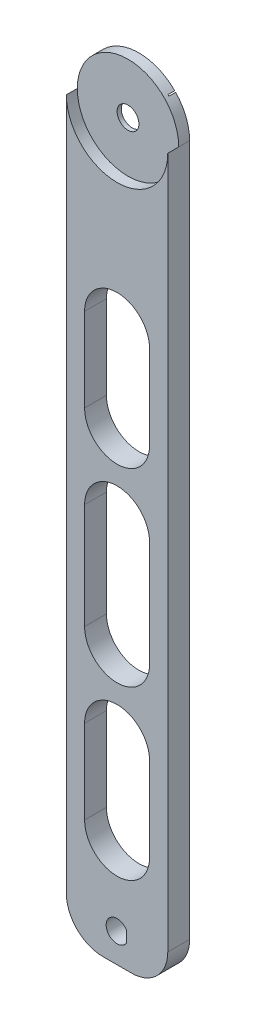
ISO-10303-21;
HEADER;
FILE_DESCRIPTION(('STEP AP214'),'2;1');
FILE_NAME('part.step','',(''),(''),'','','');
FILE_SCHEMA(('AUTOMOTIVE_DESIGN { 1 0 10303 214 1 1 1 1 }'));
ENDSEC;
DATA;
#1=APPLICATION_CONTEXT('core data for automotive mechanical design processes');
#2=APPLICATION_PROTOCOL_DEFINITION('international standard','automotive_design',2000,#1);
#3=PRODUCT_CONTEXT('',#1,'mechanical');
#4=PRODUCT('Part','Part','',(#3));
#5=PRODUCT_RELATED_PRODUCT_CATEGORY('part','',(#4));
#6=PRODUCT_DEFINITION_FORMATION('','',#4);
#7=PRODUCT_DEFINITION_CONTEXT('part definition',#1,'design');
#8=PRODUCT_DEFINITION('design','',#6,#7);
#9=PRODUCT_DEFINITION_SHAPE('','',#8);
#10=(LENGTH_UNIT() NAMED_UNIT(*) SI_UNIT(.MILLI.,.METRE.));
#11=(NAMED_UNIT(*) PLANE_ANGLE_UNIT() SI_UNIT($,.RADIAN.));
#12=(NAMED_UNIT(*) SI_UNIT($,.STERADIAN.) SOLID_ANGLE_UNIT());
#13=UNCERTAINTY_MEASURE_WITH_UNIT(LENGTH_MEASURE(1.E-05),#10,'distance_accuracy_value','');
#14=(GEOMETRIC_REPRESENTATION_CONTEXT(3) GLOBAL_UNCERTAINTY_ASSIGNED_CONTEXT((#13)) GLOBAL_UNIT_ASSIGNED_CONTEXT((#10,
#11,#12)) REPRESENTATION_CONTEXT('',''));
#15=CARTESIAN_POINT('',(0.,0.,0.));
#16=DIRECTION('',(0.,0.,1.));
#17=DIRECTION('',(1.,0.,0.));
#18=AXIS2_PLACEMENT_3D('',#15,#16,#17);
#19=CARTESIAN_POINT('',(0.,0.,0.));
#20=DIRECTION('',(0.,0.,1.));
#21=DIRECTION('',(1.,0.,0.));
#22=AXIS2_PLACEMENT_3D('',#19,#20,#21);
#23=PLANE('',#22);
#24=CARTESIAN_POINT('',(1.83507751937984,21.2113372093023,0.));
#25=DIRECTION('',(0.,0.,1.));
#26=DIRECTION('',(1.,0.,0.));
#27=AXIS2_PLACEMENT_3D('',#24,#25,#26);
#28=CIRCLE('',#27,13.925);
#29=CARTESIAN_POINT('',(11.6780001036533,31.0613372093023,0.));
#30=VERTEX_POINT('',#29);
#31=CARTESIAN_POINT('',(-8.00784506489359,31.0613372093023,0.));
#32=VERTEX_POINT('',#31);
#33=EDGE_CURVE('E361',#30,#32,#28,.T.);
#34=ORIENTED_EDGE('',*,*,#33,.F.);
#35=DIRECTION('',(1.,0.,0.));
#36=VECTOR('',#35,1.);
#37=CARTESIAN_POINT('',(11.9300775193798,31.0613372093023,0.));
#38=LINE('',#37,#36);
#39=EDGE_CURVE('E228',#32,#30,#38,.T.);
#40=ORIENTED_EDGE('',*,*,#39,.F.);
#41=EDGE_LOOP('',(#34,#40));
#42=FACE_BOUND('',#41,.T.);
#43=ADVANCED_FACE('F39',(#42),#23,.F.);
#44=CARTESIAN_POINT('',(1.83507751937984,21.2113372093023,0.));
#45=DIRECTION('',(0.,0.,1.));
#46=DIRECTION('',(1.,0.,0.));
#47=AXIS2_PLACEMENT_3D('',#44,#45,#46);
#48=CYLINDRICAL_SURFACE('',#47,3.);
#49=CARTESIAN_POINT('',(1.83507751937984,21.2113372093023,3.));
#50=DIRECTION('',(0.,0.,1.));
#51=DIRECTION('',(1.,0.,0.));
#52=AXIS2_PLACEMENT_3D('',#49,#50,#51);
#53=CIRCLE('',#52,3.);
#54=CARTESIAN_POINT('',(4.83507751937984,21.2113372093023,3.));
#55=VERTEX_POINT('',#54);
#56=EDGE_CURVE('E312',#55,#55,#53,.T.);
#57=ORIENTED_EDGE('',*,*,#56,.T.);
#58=EDGE_LOOP('',(#57));
#59=FACE_BOUND('',#58,.T.);
#60=CARTESIAN_POINT('',(1.83507751937984,21.2113372093023,1.85));
#61=DIRECTION('',(0.,0.,-1.));
#62=DIRECTION('',(-1.,0.,0.));
#63=AXIS2_PLACEMENT_3D('',#60,#61,#62);
#64=CIRCLE('',#63,3.);
#65=CARTESIAN_POINT('',(-1.16492248062016,21.2113372093023,1.85));
#66=VERTEX_POINT('',#65);
#67=EDGE_CURVE('E253',#66,#66,#64,.F.);
#68=ORIENTED_EDGE('',*,*,#67,.F.);
#69=EDGE_LOOP('',(#68));
#70=FACE_BOUND('',#69,.T.);
#71=ADVANCED_FACE('F510',(#59,#70),#48,.F.);
#72=CARTESIAN_POINT('',(5.76007751937987,-168.788662790698,6.));
#73=DIRECTION('',(0.,0.,1.));
#74=DIRECTION('',(1.,0.,0.));
#75=AXIS2_PLACEMENT_3D('',#72,#73,#74);
#76=CYLINDRICAL_SURFACE('',#75,10.);
#77=DIRECTION('',(0.,0.,-1.));
#78=VECTOR('',#77,1.);
#79=CARTESIAN_POINT('',(15.7600775193799,-168.788662790698,6.));
#80=LINE('',#79,#78);
#81=CARTESIAN_POINT('',(15.7600775193799,-168.788662790698,6.));
#82=VERTEX_POINT('',#81);
#83=CARTESIAN_POINT('',(15.7600775193799,-168.788662790698,0.));
#84=VERTEX_POINT('',#83);
#85=EDGE_CURVE('E414',#82,#84,#80,.T.);
#86=ORIENTED_EDGE('',*,*,#85,.F.);
#87=CARTESIAN_POINT('',(5.76007751937987,-168.788662790698,6.));
#88=DIRECTION('',(0.,0.,1.));
#89=DIRECTION('',(1.,0.,0.));
#90=AXIS2_PLACEMENT_3D('',#87,#88,#89);
#91=CIRCLE('',#90,10.);
#92=CARTESIAN_POINT('',(5.76007751937987,-178.788662790698,6.));
#93=VERTEX_POINT('',#92);
#94=EDGE_CURVE('E420',#93,#82,#91,.T.);
#95=ORIENTED_EDGE('',*,*,#94,.F.);
#96=DIRECTION('',(0.,0.,-1.));
#97=VECTOR('',#96,1.);
#98=CARTESIAN_POINT('',(5.76007751937987,-178.788662790698,6.));
#99=LINE('',#98,#97);
#100=CARTESIAN_POINT('',(5.76007751937987,-178.788662790698,0.));
#101=VERTEX_POINT('',#100);
#102=EDGE_CURVE('E417',#101,#93,#99,.F.);
#103=ORIENTED_EDGE('',*,*,#102,.F.);
#104=CARTESIAN_POINT('',(5.76007751937987,-168.788662790698,0.));
#105=DIRECTION('',(0.,0.,1.));
#106=DIRECTION('',(1.,0.,0.));
#107=AXIS2_PLACEMENT_3D('',#104,#105,#106);
#108=CIRCLE('',#107,10.);
#109=EDGE_CURVE('E62',#84,#101,#108,.F.);
#110=ORIENTED_EDGE('',*,*,#109,.F.);
#111=EDGE_LOOP('',(#86,#95,#103,#110));
#112=FACE_BOUND('',#111,.T.);
#113=ADVANCED_FACE('F41',(#112),#76,.T.);
#114=CARTESIAN_POINT('',(-2.08992248062013,-168.788662790698,6.));
#115=DIRECTION('',(0.,0.,1.));
#116=DIRECTION('',(1.,0.,0.));
#117=AXIS2_PLACEMENT_3D('',#114,#115,#116);
#118=CYLINDRICAL_SURFACE('',#117,10.);
#119=DIRECTION('',(0.,0.,1.));
#120=VECTOR('',#119,1.);
#121=CARTESIAN_POINT('',(-12.0899224806201,-168.788662790698,6.));
#122=LINE('',#121,#120);
#123=CARTESIAN_POINT('',(-12.0899224806201,-168.788662790698,0.));
#124=VERTEX_POINT('',#123);
#125=CARTESIAN_POINT('',(-12.0899224806201,-168.788662790698,6.));
#126=VERTEX_POINT('',#125);
#127=EDGE_CURVE('E404',#124,#126,#122,.T.);
#128=ORIENTED_EDGE('',*,*,#127,.F.);
#129=CARTESIAN_POINT('',(-2.08992248062013,-168.788662790698,0.));
#130=DIRECTION('',(0.,0.,1.));
#131=DIRECTION('',(1.,0.,0.));
#132=AXIS2_PLACEMENT_3D('',#129,#130,#131);
#133=CIRCLE('',#132,10.);
#134=CARTESIAN_POINT('',(-2.08992248062013,-178.788662790698,0.));
#135=VERTEX_POINT('',#134);
#136=EDGE_CURVE('E410',#135,#124,#133,.F.);
#137=ORIENTED_EDGE('',*,*,#136,.F.);
#138=DIRECTION('',(0.,0.,1.));
#139=VECTOR('',#138,1.);
#140=CARTESIAN_POINT('',(-2.08992248062013,-178.788662790698,6.));
#141=LINE('',#140,#139);
#142=CARTESIAN_POINT('',(-2.08992248062013,-178.788662790698,6.));
#143=VERTEX_POINT('',#142);
#144=EDGE_CURVE('E407',#143,#135,#141,.F.);
#145=ORIENTED_EDGE('',*,*,#144,.F.);
#146=CARTESIAN_POINT('',(-2.08992248062013,-168.788662790698,6.));
#147=DIRECTION('',(0.,0.,1.));
#148=DIRECTION('',(1.,0.,0.));
#149=AXIS2_PLACEMENT_3D('',#146,#147,#148);
#150=CIRCLE('',#149,10.);
#151=EDGE_CURVE('E412',#126,#143,#150,.T.);
#152=ORIENTED_EDGE('',*,*,#151,.F.);
#153=EDGE_LOOP('',(#128,#137,#145,#152));
#154=FACE_BOUND('',#153,.T.);
#155=ADVANCED_FACE('F462',(#154),#118,.T.);
#156=CARTESIAN_POINT('',(0.,0.,6.));
#157=DIRECTION('',(0.,0.,1.));
#158=DIRECTION('',(1.,0.,0.));
#159=AXIS2_PLACEMENT_3D('',#156,#157,#158);
#160=PLANE('',#159);
#161=CARTESIAN_POINT('',(1.83507751937984,-125.788662790698,6.));
#162=DIRECTION('',(0.,0.,1.));
#163=DIRECTION('',(1.,0.,0.));
#164=AXIS2_PLACEMENT_3D('',#161,#162,#163);
#165=CIRCLE('',#164,8.925);
#166=CARTESIAN_POINT('',(10.7600775193798,-125.788662790698,6.));
#167=VERTEX_POINT('',#166);
#168=CARTESIAN_POINT('',(-7.08992248062015,-125.788662790698,6.));
#169=VERTEX_POINT('',#168);
#170=EDGE_CURVE('E257',#167,#169,#165,.T.);
#171=ORIENTED_EDGE('',*,*,#170,.F.);
#172=DIRECTION('',(0.,-1.,0.));
#173=VECTOR('',#172,1.);
#174=CARTESIAN_POINT('',(10.7600775193798,0.,6.));
#175=LINE('',#174,#173);
#176=CARTESIAN_POINT('',(10.7600775193798,-148.788662790698,6.));
#177=VERTEX_POINT('',#176);
#178=EDGE_CURVE('E265',#167,#177,#175,.T.);
#179=ORIENTED_EDGE('',*,*,#178,.T.);
#180=CARTESIAN_POINT('',(1.83507751937985,-148.788662790698,6.));
#181=DIRECTION('',(0.,0.,1.));
#182=DIRECTION('',(1.,0.,0.));
#183=AXIS2_PLACEMENT_3D('',#180,#181,#182);
#184=CIRCLE('',#183,8.925);
#185=CARTESIAN_POINT('',(-7.08992248062015,-148.788662790698,6.));
#186=VERTEX_POINT('',#185);
#187=EDGE_CURVE('E262',#186,#177,#184,.T.);
#188=ORIENTED_EDGE('',*,*,#187,.F.);
#189=DIRECTION('',(0.,-1.,0.));
#190=VECTOR('',#189,1.);
#191=CARTESIAN_POINT('',(-7.08992248062018,0.,6.));
#192=LINE('',#191,#190);
#193=EDGE_CURVE('E259',#169,#186,#192,.T.);
#194=ORIENTED_EDGE('',*,*,#193,.F.);
#195=EDGE_LOOP('',(#171,#179,#188,#194));
#196=FACE_BOUND('',#195,.T.);
#197=CARTESIAN_POINT('',(1.83507751937984,-27.7886627906977,6.));
#198=DIRECTION('',(0.,0.,1.));
#199=DIRECTION('',(1.,0.,0.));
#200=AXIS2_PLACEMENT_3D('',#197,#198,#199);
#201=CIRCLE('',#200,8.925);
#202=CARTESIAN_POINT('',(10.7600775193798,-27.7886627906977,6.));
#203=VERTEX_POINT('',#202);
#204=CARTESIAN_POINT('',(-7.08992248062015,-27.7886627906977,6.));
#205=VERTEX_POINT('',#204);
#206=EDGE_CURVE('E292',#203,#205,#201,.T.);
#207=ORIENTED_EDGE('',*,*,#206,.F.);
#208=DIRECTION('',(0.,-1.,0.));
#209=VECTOR('',#208,1.);
#210=CARTESIAN_POINT('',(10.7600775193798,0.,6.));
#211=LINE('',#210,#209);
#212=CARTESIAN_POINT('',(10.7600775193798,-50.7886627906977,6.));
#213=VERTEX_POINT('',#212);
#214=EDGE_CURVE('E306',#203,#213,#211,.T.);
#215=ORIENTED_EDGE('',*,*,#214,.T.);
#216=CARTESIAN_POINT('',(1.83507751937985,-50.7886627906977,6.));
#217=DIRECTION('',(0.,0.,1.));
#218=DIRECTION('',(1.,0.,0.));
#219=AXIS2_PLACEMENT_3D('',#216,#217,#218);
#220=CIRCLE('',#219,8.925);
#221=CARTESIAN_POINT('',(-7.08992248062015,-50.7886627906977,6.));
#222=VERTEX_POINT('',#221);
#223=EDGE_CURVE('E303',#222,#213,#220,.T.);
#224=ORIENTED_EDGE('',*,*,#223,.F.);
#225=DIRECTION('',(0.,-1.,0.));
#226=VECTOR('',#225,1.);
#227=CARTESIAN_POINT('',(-7.08992248062016,0.,6.));
#228=LINE('',#227,#226);
#229=EDGE_CURVE('E300',#205,#222,#228,.T.);
#230=ORIENTED_EDGE('',*,*,#229,.F.);
#231=EDGE_LOOP('',(#207,#215,#224,#230));
#232=FACE_BOUND('',#231,.T.);
#233=DIRECTION('',(1.,0.,0.));
#234=VECTOR('',#233,1.);
#235=CARTESIAN_POINT('',(0.,-178.788662790698,6.));
#236=LINE('',#235,#234);
#237=EDGE_CURVE('E351',#143,#93,#236,.T.);
#238=ORIENTED_EDGE('',*,*,#237,.T.);
#239=ORIENTED_EDGE('',*,*,#94,.T.);
#240=DIRECTION('',(0.,-1.,0.));
#241=VECTOR('',#240,1.);
#242=CARTESIAN_POINT('',(15.7600775193798,0.,6.));
#243=LINE('',#242,#241);
#244=CARTESIAN_POINT('',(15.7600775193798,21.2113372093023,6.));
#245=VERTEX_POINT('',#244);
#246=EDGE_CURVE('E344',#245,#82,#243,.T.);
#247=ORIENTED_EDGE('',*,*,#246,.F.);
#248=CARTESIAN_POINT('',(1.83507751937984,21.2113372093023,6.));
#249=DIRECTION('',(0.,0.,1.));
#250=DIRECTION('',(1.,0.,0.));
#251=AXIS2_PLACEMENT_3D('',#248,#249,#250);
#252=CIRCLE('',#251,13.925);
#253=CARTESIAN_POINT('',(-12.0899224806202,21.2113372093023,6.));
#254=VERTEX_POINT('',#253);
#255=EDGE_CURVE('E321',#254,#245,#252,.T.);
#256=ORIENTED_EDGE('',*,*,#255,.F.);
#257=DIRECTION('',(0.,-1.,0.));
#258=VECTOR('',#257,1.);
#259=CARTESIAN_POINT('',(-12.0899224806202,0.,6.));
#260=LINE('',#259,#258);
#261=EDGE_CURVE('E347',#254,#126,#260,.T.);
#262=ORIENTED_EDGE('',*,*,#261,.T.);
#263=ORIENTED_EDGE('',*,*,#151,.T.);
#264=EDGE_LOOP('',(#238,#239,#247,#256,#262,#263));
#265=FACE_BOUND('',#264,.T.);
#266=CARTESIAN_POINT('',(1.83507751937984,-170.788662790698,6.));
#267=DIRECTION('',(0.,0.,1.));
#268=DIRECTION('',(1.,0.,0.));
#269=AXIS2_PLACEMENT_3D('',#266,#267,#268);
#270=CIRCLE('',#269,3.);
#271=CARTESIAN_POINT('',(4.43315373073316,-169.288662790698,6.));
#272=VERTEX_POINT('',#271);
#273=CARTESIAN_POINT('',(4.43315373073316,-172.288662790698,6.));
#274=VERTEX_POINT('',#273);
#275=EDGE_CURVE('E331',#272,#274,#270,.T.);
#276=ORIENTED_EDGE('',*,*,#275,.F.);
#277=DIRECTION('',(0.,-1.,0.));
#278=VECTOR('',#277,1.);
#279=CARTESIAN_POINT('',(4.43315373073316,0.,6.));
#280=LINE('',#279,#278);
#281=EDGE_CURVE('E324',#272,#274,#280,.T.);
#282=ORIENTED_EDGE('',*,*,#281,.T.);
#283=EDGE_LOOP('',(#276,#282));
#284=FACE_BOUND('',#283,.T.);
#285=DIRECTION('',(0.,-1.,0.));
#286=VECTOR('',#285,1.);
#287=CARTESIAN_POINT('',(-7.08992248062017,0.,6.));
#288=LINE('',#287,#286);
#289=CARTESIAN_POINT('',(-7.08992248062015,-73.7886627906977,6.));
#290=VERTEX_POINT('',#289);
#291=CARTESIAN_POINT('',(-7.08992248062015,-102.788662790698,6.));
#292=VERTEX_POINT('',#291);
#293=EDGE_CURVE('E280',#290,#292,#288,.T.);
#294=ORIENTED_EDGE('',*,*,#293,.F.);
#295=CARTESIAN_POINT('',(1.83507751937984,-73.7886627906977,6.));
#296=DIRECTION('',(0.,0.,1.));
#297=DIRECTION('',(1.,0.,0.));
#298=AXIS2_PLACEMENT_3D('',#295,#296,#297);
#299=CIRCLE('',#298,8.925);
#300=CARTESIAN_POINT('',(10.7600775193798,-73.7886627906977,6.));
#301=VERTEX_POINT('',#300);
#302=EDGE_CURVE('E271',#290,#301,#299,.F.);
#303=ORIENTED_EDGE('',*,*,#302,.T.);
#304=DIRECTION('',(0.,-1.,0.));
#305=VECTOR('',#304,1.);
#306=CARTESIAN_POINT('',(10.7600775193798,0.,6.));
#307=LINE('',#306,#305);
#308=CARTESIAN_POINT('',(10.7600775193798,-102.788662790698,6.));
#309=VERTEX_POINT('',#308);
#310=EDGE_CURVE('E286',#301,#309,#307,.T.);
#311=ORIENTED_EDGE('',*,*,#310,.T.);
#312=CARTESIAN_POINT('',(1.83507751937985,-102.788662790698,6.));
#313=DIRECTION('',(0.,0.,1.));
#314=DIRECTION('',(1.,0.,0.));
#315=AXIS2_PLACEMENT_3D('',#312,#313,#314);
#316=CIRCLE('',#315,8.925);
#317=EDGE_CURVE('E283',#292,#309,#316,.T.);
#318=ORIENTED_EDGE('',*,*,#317,.F.);
#319=EDGE_LOOP('',(#294,#303,#311,#318));
#320=FACE_BOUND('',#319,.T.);
#321=ADVANCED_FACE('F475',(#196,#232,#265,#284,#320),#160,.T.);
#322=DIRECTION('',(0.,-1.,0.));
#323=VECTOR('',#322,1.);
#324=CARTESIAN_POINT('',(10.7600775193798,0.,0.));
#325=LINE('',#324,#323);
#326=CARTESIAN_POINT('',(10.7600775193798,-125.788662790698,0.));
#327=VERTEX_POINT('',#326);
#328=CARTESIAN_POINT('',(10.7600775193798,-148.788662790698,0.));
#329=VERTEX_POINT('',#328);
#330=EDGE_CURVE('E399',#327,#329,#325,.T.);
#331=ORIENTED_EDGE('',*,*,#330,.F.);
#332=CARTESIAN_POINT('',(1.83507751937984,-125.788662790698,0.));
#333=DIRECTION('',(0.,0.,1.));
#334=DIRECTION('',(1.,0.,0.));
#335=AXIS2_PLACEMENT_3D('',#332,#333,#334);
#336=CIRCLE('',#335,8.925);
#337=CARTESIAN_POINT('',(-7.08992248062015,-125.788662790698,0.));
#338=VERTEX_POINT('',#337);
#339=EDGE_CURVE('E401',#327,#338,#336,.T.);
#340=ORIENTED_EDGE('',*,*,#339,.T.);
#341=DIRECTION('',(0.,-1.,0.));
#342=VECTOR('',#341,1.);
#343=CARTESIAN_POINT('',(-7.08992248062018,0.,0.));
#344=LINE('',#343,#342);
#345=CARTESIAN_POINT('',(-7.08992248062015,-148.788662790698,0.));
#346=VERTEX_POINT('',#345);
#347=EDGE_CURVE('E393',#338,#346,#344,.T.);
#348=ORIENTED_EDGE('',*,*,#347,.T.);
#349=CARTESIAN_POINT('',(1.83507751937985,-148.788662790698,0.));
#350=DIRECTION('',(0.,0.,1.));
#351=DIRECTION('',(1.,0.,0.));
#352=AXIS2_PLACEMENT_3D('',#349,#350,#351);
#353=CIRCLE('',#352,8.925);
#354=EDGE_CURVE('E396',#346,#329,#353,.T.);
#355=ORIENTED_EDGE('',*,*,#354,.T.);
#356=EDGE_LOOP('',(#331,#340,#348,#355));
#357=FACE_BOUND('',#356,.T.);
#358=DIRECTION('',(0.,-1.,0.));
#359=VECTOR('',#358,1.);
#360=CARTESIAN_POINT('',(4.43315373073316,0.,0.));
#361=LINE('',#360,#359);
#362=CARTESIAN_POINT('',(4.43315373073316,-169.288662790698,0.));
#363=VERTEX_POINT('',#362);
#364=CARTESIAN_POINT('',(4.43315373073316,-172.288662790698,0.));
#365=VERTEX_POINT('',#364);
#366=EDGE_CURVE('E327',#363,#365,#361,.T.);
#367=ORIENTED_EDGE('',*,*,#366,.F.);
#368=CARTESIAN_POINT('',(1.83507751937984,-170.788662790698,0.));
#369=DIRECTION('',(0.,0.,1.));
#370=DIRECTION('',(1.,0.,0.));
#371=AXIS2_PLACEMENT_3D('',#368,#369,#370);
#372=CIRCLE('',#371,3.);
#373=EDGE_CURVE('E330',#363,#365,#372,.T.);
#374=ORIENTED_EDGE('',*,*,#373,.T.);
#375=EDGE_LOOP('',(#367,#374));
#376=FACE_BOUND('',#375,.T.);
#377=DIRECTION('',(-1.,0.,0.));
#378=VECTOR('',#377,1.);
#379=CARTESIAN_POINT('',(11.9300775193798,-9.23866279069767,0.));
#380=LINE('',#379,#378);
#381=CARTESIAN_POINT('',(11.9300775193798,-9.23866279069767,0.));
#382=VERTEX_POINT('',#381);
#383=CARTESIAN_POINT('',(-8.26992248062016,-9.23866279069767,0.));
#384=VERTEX_POINT('',#383);
#385=EDGE_CURVE('E248',#382,#384,#380,.T.);
#386=ORIENTED_EDGE('',*,*,#385,.F.);
#387=DIRECTION('',(0.,-1.,0.));
#388=VECTOR('',#387,1.);
#389=CARTESIAN_POINT('',(11.9300775193798,31.0613372093023,0.));
#390=LINE('',#389,#388);
#391=CARTESIAN_POINT('',(11.9300775193798,30.8028230170383,0.));
#392=VERTEX_POINT('',#391);
#393=EDGE_CURVE('E234',#392,#382,#390,.T.);
#394=ORIENTED_EDGE('',*,*,#393,.F.);
#395=CARTESIAN_POINT('',(15.7600775193798,21.2113372093023,0.));
#396=VERTEX_POINT('',#395);
#397=EDGE_CURVE('E357',#396,#392,#28,.T.);
#398=ORIENTED_EDGE('',*,*,#397,.F.);
#399=DIRECTION('',(0.,-1.,0.));
#400=VECTOR('',#399,1.);
#401=CARTESIAN_POINT('',(15.7600775193798,0.,0.));
#402=LINE('',#401,#400);
#403=EDGE_CURVE('E341',#396,#84,#402,.T.);
#404=ORIENTED_EDGE('',*,*,#403,.T.);
#405=ORIENTED_EDGE('',*,*,#109,.T.);
#406=DIRECTION('',(1.,0.,0.));
#407=VECTOR('',#406,1.);
#408=CARTESIAN_POINT('',(0.,-178.788662790698,0.));
#409=LINE('',#408,#407);
#410=EDGE_CURVE('E348',#135,#101,#409,.T.);
#411=ORIENTED_EDGE('',*,*,#410,.F.);
#412=ORIENTED_EDGE('',*,*,#136,.T.);
#413=DIRECTION('',(0.,-1.,0.));
#414=VECTOR('',#413,1.);
#415=CARTESIAN_POINT('',(-12.0899224806202,0.,0.));
#416=LINE('',#415,#414);
#417=CARTESIAN_POINT('',(-12.0899224806202,21.2113372093023,0.));
#418=VERTEX_POINT('',#417);
#419=EDGE_CURVE('E360',#418,#124,#416,.T.);
#420=ORIENTED_EDGE('',*,*,#419,.F.);
#421=CARTESIAN_POINT('',(-8.26992248062016,30.7922870578299,0.));
#422=VERTEX_POINT('',#421);
#423=EDGE_CURVE('E356',#422,#418,#28,.T.);
#424=ORIENTED_EDGE('',*,*,#423,.F.);
#425=DIRECTION('',(0.,1.,0.));
#426=VECTOR('',#425,1.);
#427=CARTESIAN_POINT('',(-8.26992248062016,31.0613372093023,0.));
#428=LINE('',#427,#426);
#429=EDGE_CURVE('E250',#384,#422,#428,.T.);
#430=ORIENTED_EDGE('',*,*,#429,.F.);
#431=EDGE_LOOP('',(#386,#394,#398,#404,#405,#411,#412,#420,#424,#430));
#432=FACE_BOUND('',#431,.T.);
#433=DIRECTION('',(0.,-1.,0.));
#434=VECTOR('',#433,1.);
#435=CARTESIAN_POINT('',(10.7600775193798,0.,0.));
#436=LINE('',#435,#434);
#437=CARTESIAN_POINT('',(10.7600775193798,-27.7886627906977,0.));
#438=VERTEX_POINT('',#437);
#439=CARTESIAN_POINT('',(10.7600775193798,-50.7886627906977,0.));
#440=VERTEX_POINT('',#439);
#441=EDGE_CURVE('E378',#438,#440,#436,.T.);
#442=ORIENTED_EDGE('',*,*,#441,.F.);
#443=CARTESIAN_POINT('',(1.83507751937984,-27.7886627906977,0.));
#444=DIRECTION('',(0.,0.,1.));
#445=DIRECTION('',(1.,0.,0.));
#446=AXIS2_PLACEMENT_3D('',#443,#444,#445);
#447=CIRCLE('',#446,8.925);
#448=CARTESIAN_POINT('',(-7.08992248062015,-27.7886627906977,0.));
#449=VERTEX_POINT('',#448);
#450=EDGE_CURVE('E380',#438,#449,#447,.T.);
#451=ORIENTED_EDGE('',*,*,#450,.T.);
#452=DIRECTION('',(0.,-1.,0.));
#453=VECTOR('',#452,1.);
#454=CARTESIAN_POINT('',(-7.08992248062016,0.,0.));
#455=LINE('',#454,#453);
#456=CARTESIAN_POINT('',(-7.08992248062015,-50.7886627906977,0.));
#457=VERTEX_POINT('',#456);
#458=EDGE_CURVE('E372',#449,#457,#455,.T.);
#459=ORIENTED_EDGE('',*,*,#458,.T.);
#460=CARTESIAN_POINT('',(1.83507751937985,-50.7886627906977,0.));
#461=DIRECTION('',(0.,0.,1.));
#462=DIRECTION('',(1.,0.,0.));
#463=AXIS2_PLACEMENT_3D('',#460,#461,#462);
#464=CIRCLE('',#463,8.925);
#465=EDGE_CURVE('E375',#457,#440,#464,.T.);
#466=ORIENTED_EDGE('',*,*,#465,.T.);
#467=EDGE_LOOP('',(#442,#451,#459,#466));
#468=FACE_BOUND('',#467,.T.);
#469=CARTESIAN_POINT('',(1.83507751937984,-73.7886627906977,0.));
#470=DIRECTION('',(0.,0.,1.));
#471=DIRECTION('',(1.,0.,0.));
#472=AXIS2_PLACEMENT_3D('',#469,#470,#471);
#473=CIRCLE('',#472,8.925);
#474=CARTESIAN_POINT('',(-7.08992248062015,-73.7886627906977,0.));
#475=VERTEX_POINT('',#474);
#476=CARTESIAN_POINT('',(10.7600775193798,-73.7886627906977,0.));
#477=VERTEX_POINT('',#476);
#478=EDGE_CURVE('E391',#475,#477,#473,.F.);
#479=ORIENTED_EDGE('',*,*,#478,.F.);
#480=DIRECTION('',(0.,-1.,0.));
#481=VECTOR('',#480,1.);
#482=CARTESIAN_POINT('',(-7.08992248062017,0.,0.));
#483=LINE('',#482,#481);
#484=CARTESIAN_POINT('',(-7.08992248062015,-102.788662790698,0.));
#485=VERTEX_POINT('',#484);
#486=EDGE_CURVE('E383',#475,#485,#483,.T.);
#487=ORIENTED_EDGE('',*,*,#486,.T.);
#488=CARTESIAN_POINT('',(1.83507751937985,-102.788662790698,0.));
#489=DIRECTION('',(0.,0.,1.));
#490=DIRECTION('',(1.,0.,0.));
#491=AXIS2_PLACEMENT_3D('',#488,#489,#490);
#492=CIRCLE('',#491,8.925);
#493=CARTESIAN_POINT('',(10.7600775193798,-102.788662790698,0.));
#494=VERTEX_POINT('',#493);
#495=EDGE_CURVE('E386',#485,#494,#492,.T.);
#496=ORIENTED_EDGE('',*,*,#495,.T.);
#497=DIRECTION('',(0.,-1.,0.));
#498=VECTOR('',#497,1.);
#499=CARTESIAN_POINT('',(10.7600775193798,0.,0.));
#500=LINE('',#499,#498);
#501=EDGE_CURVE('E389',#477,#494,#500,.T.);
#502=ORIENTED_EDGE('',*,*,#501,.F.);
#503=EDGE_LOOP('',(#479,#487,#496,#502));
#504=FACE_BOUND('',#503,.T.);
#505=ADVANCED_FACE('F440',(#357,#376,#432,#468,#504),#23,.F.);
#506=CARTESIAN_POINT('',(1.83507751937984,21.2113372093023,6.));
#507=DIRECTION('',(0.,0.,-1.));
#508=DIRECTION('',(-1.,0.,0.));
#509=AXIS2_PLACEMENT_3D('',#506,#507,#508);
#510=CYLINDRICAL_SURFACE('',#509,13.925);
#511=ORIENTED_EDGE('',*,*,#33,.T.);
#512=DIRECTION('',(0.,0.,-1.));
#513=VECTOR('',#512,1.);
#514=CARTESIAN_POINT('',(-8.00784506489359,31.0613372093023,6.));
#515=LINE('',#514,#513);
#516=CARTESIAN_POINT('',(-8.00784506489359,31.0613372093023,1.85));
#517=VERTEX_POINT('',#516);
#518=EDGE_CURVE('E11',#32,#517,#515,.F.);
#519=ORIENTED_EDGE('',*,*,#518,.T.);
#520=CARTESIAN_POINT('',(1.83507751937984,21.2113372093023,1.85));
#521=DIRECTION('',(0.,0.,-1.));
#522=DIRECTION('',(-1.,0.,0.));
#523=AXIS2_PLACEMENT_3D('',#520,#521,#522);
#524=CIRCLE('',#523,13.925);
#525=CARTESIAN_POINT('',(-8.26992248062016,30.7922870578299,1.85));
#526=VERTEX_POINT('',#525);
#527=EDGE_CURVE('E256',#526,#517,#524,.T.);
#528=ORIENTED_EDGE('',*,*,#527,.F.);
#529=DIRECTION('',(0.,0.,-1.));
#530=VECTOR('',#529,1.);
#531=CARTESIAN_POINT('',(-8.26992248062016,30.7922870578299,6.));
#532=LINE('',#531,#530);
#533=EDGE_CURVE('E47',#526,#422,#532,.T.);
#534=ORIENTED_EDGE('',*,*,#533,.T.);
#535=ORIENTED_EDGE('',*,*,#423,.T.);
#536=DIRECTION('',(0.,0.,-1.));
#537=VECTOR('',#536,1.);
#538=CARTESIAN_POINT('',(-12.0899224806202,21.2113372093023,6.));
#539=LINE('',#538,#537);
#540=CARTESIAN_POINT('',(-12.0899224806202,21.2113372093023,3.));
#541=VERTEX_POINT('',#540);
#542=EDGE_CURVE('E354',#541,#418,#539,.T.);
#543=ORIENTED_EDGE('',*,*,#542,.F.);
#544=CARTESIAN_POINT('',(1.83507751937984,21.2113372093023,3.));
#545=DIRECTION('',(0.,0.,1.));
#546=DIRECTION('',(1.,0.,0.));
#547=AXIS2_PLACEMENT_3D('',#544,#545,#546);
#548=CIRCLE('',#547,13.925);
#549=CARTESIAN_POINT('',(15.7600775193798,21.2113372093023,3.));
#550=VERTEX_POINT('',#549);
#551=EDGE_CURVE('E322',#550,#541,#548,.T.);
#552=ORIENTED_EDGE('',*,*,#551,.F.);
#553=DIRECTION('',(0.,0.,-1.));
#554=VECTOR('',#553,1.);
#555=CARTESIAN_POINT('',(15.7600775193798,21.2113372093023,6.));
#556=LINE('',#555,#554);
#557=EDGE_CURVE('E369',#550,#396,#556,.T.);
#558=ORIENTED_EDGE('',*,*,#557,.T.);
#559=ORIENTED_EDGE('',*,*,#397,.T.);
#560=DIRECTION('',(0.,0.,-1.));
#561=VECTOR('',#560,1.);
#562=CARTESIAN_POINT('',(11.9300775193798,30.8028230170383,6.));
#563=LINE('',#562,#561);
#564=CARTESIAN_POINT('',(11.9300775193798,30.8028230170383,1.85));
#565=VERTEX_POINT('',#564);
#566=EDGE_CURVE('E428',#392,#565,#563,.F.);
#567=ORIENTED_EDGE('',*,*,#566,.T.);
#568=CARTESIAN_POINT('',(11.6780001036533,31.0613372093023,1.85));
#569=VERTEX_POINT('',#568);
#570=EDGE_CURVE('E225',#569,#565,#524,.T.);
#571=ORIENTED_EDGE('',*,*,#570,.F.);
#572=DIRECTION('',(0.,0.,-1.));
#573=VECTOR('',#572,1.);
#574=CARTESIAN_POINT('',(11.6780001036533,31.0613372093023,6.));
#575=LINE('',#574,#573);
#576=EDGE_CURVE('E423',#569,#30,#575,.T.);
#577=ORIENTED_EDGE('',*,*,#576,.T.);
#578=EDGE_LOOP('',(#511,#519,#528,#534,#535,#543,#552,#558,#559,#567,#571,#577));
#579=FACE_BOUND('',#578,.T.);
#580=ADVANCED_FACE('F434',(#579),#510,.T.);
#581=CARTESIAN_POINT('',(15.7600775193798,0.,6.));
#582=DIRECTION('',(1.,0.,0.));
#583=DIRECTION('',(0.,1.,0.));
#584=AXIS2_PLACEMENT_3D('',#581,#582,#583);
#585=PLANE('',#584);
#586=ORIENTED_EDGE('',*,*,#246,.T.);
#587=ORIENTED_EDGE('',*,*,#85,.T.);
#588=ORIENTED_EDGE('',*,*,#403,.F.);
#589=ORIENTED_EDGE('',*,*,#557,.F.);
#590=EDGE_CURVE('E370',#245,#550,#556,.T.);
#591=ORIENTED_EDGE('',*,*,#590,.F.);
#592=EDGE_LOOP('',(#586,#587,#588,#589,#591));
#593=FACE_BOUND('',#592,.T.);
#594=ADVANCED_FACE('F451',(#593),#585,.T.);
#595=CARTESIAN_POINT('',(-12.0899224806202,0.,6.));
#596=DIRECTION('',(1.,0.,0.));
#597=DIRECTION('',(0.,1.,0.));
#598=AXIS2_PLACEMENT_3D('',#595,#596,#597);
#599=PLANE('',#598);
#600=ORIENTED_EDGE('',*,*,#419,.T.);
#601=ORIENTED_EDGE('',*,*,#127,.T.);
#602=ORIENTED_EDGE('',*,*,#261,.F.);
#603=EDGE_CURVE('E366',#254,#541,#539,.T.);
#604=ORIENTED_EDGE('',*,*,#603,.T.);
#605=ORIENTED_EDGE('',*,*,#542,.T.);
#606=EDGE_LOOP('',(#600,#601,#602,#604,#605));
#607=FACE_BOUND('',#606,.T.);
#608=ADVANCED_FACE('F465',(#607),#599,.F.);
#609=CARTESIAN_POINT('',(0.,-178.788662790698,6.));
#610=DIRECTION('',(0.,1.,0.));
#611=DIRECTION('',(0.,0.,1.));
#612=AXIS2_PLACEMENT_3D('',#609,#610,#611);
#613=PLANE('',#612);
#614=ORIENTED_EDGE('',*,*,#410,.T.);
#615=ORIENTED_EDGE('',*,*,#102,.T.);
#616=ORIENTED_EDGE('',*,*,#237,.F.);
#617=ORIENTED_EDGE('',*,*,#144,.T.);
#618=EDGE_LOOP('',(#614,#615,#616,#617));
#619=FACE_BOUND('',#618,.T.);
#620=ADVANCED_FACE('F458',(#619),#613,.F.);
#621=CARTESIAN_POINT('',(4.43315373073316,0.,0.));
#622=DIRECTION('',(-1.,0.,0.));
#623=DIRECTION('',(0.,0.,1.));
#624=AXIS2_PLACEMENT_3D('',#621,#622,#623);
#625=PLANE('',#624);
#626=ORIENTED_EDGE('',*,*,#281,.F.);
#627=DIRECTION('',(0.,0.,1.));
#628=VECTOR('',#627,1.);
#629=CARTESIAN_POINT('',(4.43315373073316,-169.288662790698,0.));
#630=LINE('',#629,#628);
#631=EDGE_CURVE('E334',#363,#272,#630,.T.);
#632=ORIENTED_EDGE('',*,*,#631,.F.);
#633=ORIENTED_EDGE('',*,*,#366,.T.);
#634=DIRECTION('',(0.,0.,1.));
#635=VECTOR('',#634,1.);
#636=CARTESIAN_POINT('',(4.43315373073316,-172.288662790698,0.));
#637=LINE('',#636,#635);
#638=EDGE_CURVE('E339',#365,#274,#637,.T.);
#639=ORIENTED_EDGE('',*,*,#638,.T.);
#640=EDGE_LOOP('',(#626,#632,#633,#639));
#641=FACE_BOUND('',#640,.T.);
#642=ADVANCED_FACE('F529',(#641),#625,.T.);
#643=CARTESIAN_POINT('',(1.83507751937984,-170.788662790698,0.));
#644=DIRECTION('',(0.,0.,1.));
#645=DIRECTION('',(1.,0.,0.));
#646=AXIS2_PLACEMENT_3D('',#643,#644,#645);
#647=CYLINDRICAL_SURFACE('',#646,3.);
#648=ORIENTED_EDGE('',*,*,#275,.T.);
#649=ORIENTED_EDGE('',*,*,#638,.F.);
#650=ORIENTED_EDGE('',*,*,#373,.F.);
#651=ORIENTED_EDGE('',*,*,#631,.T.);
#652=EDGE_LOOP('',(#648,#649,#650,#651));
#653=FACE_BOUND('',#652,.T.);
#654=ADVANCED_FACE('F531',(#653),#647,.F.);
#655=CARTESIAN_POINT('',(1.83507751937984,21.2113372093023,3.));
#656=DIRECTION('',(0.,0.,1.));
#657=DIRECTION('',(1.,0.,0.));
#658=AXIS2_PLACEMENT_3D('',#655,#656,#657);
#659=CYLINDRICAL_SURFACE('',#658,13.925);
#660=EDGE_CURVE('E325',#541,#550,#548,.T.);
#661=ORIENTED_EDGE('',*,*,#660,.F.);
#662=ORIENTED_EDGE('',*,*,#603,.F.);
#663=ORIENTED_EDGE('',*,*,#255,.T.);
#664=ORIENTED_EDGE('',*,*,#590,.T.);
#665=EDGE_LOOP('',(#661,#662,#663,#664));
#666=FACE_BOUND('',#665,.T.);
#667=ADVANCED_FACE('F472',(#666),#659,.F.);
#668=CARTESIAN_POINT('',(1.83507751937984,21.2113372093023,3.));
#669=DIRECTION('',(0.,0.,1.));
#670=DIRECTION('',(1.,0.,0.));
#671=AXIS2_PLACEMENT_3D('',#668,#669,#670);
#672=PLANE('',#671);
#673=ORIENTED_EDGE('',*,*,#56,.F.);
#674=EDGE_LOOP('',(#673));
#675=FACE_BOUND('',#674,.T.);
#676=ORIENTED_EDGE('',*,*,#551,.T.);
#677=ORIENTED_EDGE('',*,*,#660,.T.);
#678=EDGE_LOOP('',(#676,#677));
#679=FACE_BOUND('',#678,.T.);
#680=ADVANCED_FACE('F470',(#675,#679),#672,.T.);
#681=CARTESIAN_POINT('',(1.83507751937984,-27.7886627906977,-4.));
#682=DIRECTION('',(0.,0.,1.));
#683=DIRECTION('',(1.,0.,0.));
#684=AXIS2_PLACEMENT_3D('',#681,#682,#683);
#685=CYLINDRICAL_SURFACE('',#684,8.925);
#686=DIRECTION('',(0.,0.,1.));
#687=VECTOR('',#686,1.);
#688=CARTESIAN_POINT('',(10.7600775193798,-27.7886627906977,-4.));
#689=LINE('',#688,#687);
#690=EDGE_CURVE('E310',#438,#203,#689,.T.);
#691=ORIENTED_EDGE('',*,*,#690,.T.);
#692=ORIENTED_EDGE('',*,*,#206,.T.);
#693=DIRECTION('',(0.,0.,1.));
#694=VECTOR('',#693,1.);
#695=CARTESIAN_POINT('',(-7.08992248062015,-27.7886627906977,-4.));
#696=LINE('',#695,#694);
#697=EDGE_CURVE('E309',#449,#205,#696,.T.);
#698=ORIENTED_EDGE('',*,*,#697,.F.);
#699=ORIENTED_EDGE('',*,*,#450,.F.);
#700=EDGE_LOOP('',(#691,#692,#698,#699));
#701=FACE_BOUND('',#700,.T.);
#702=ADVANCED_FACE('F542',(#701),#685,.F.);
#703=CARTESIAN_POINT('',(10.7600775193798,0.,-4.));
#704=DIRECTION('',(-1.,0.,0.));
#705=DIRECTION('',(0.,0.,1.));
#706=AXIS2_PLACEMENT_3D('',#703,#704,#705);
#707=PLANE('',#706);
#708=ORIENTED_EDGE('',*,*,#441,.T.);
#709=DIRECTION('',(0.,0.,1.));
#710=VECTOR('',#709,1.);
#711=CARTESIAN_POINT('',(10.7600775193798,-50.7886627906977,-4.));
#712=LINE('',#711,#710);
#713=EDGE_CURVE('E313',#440,#213,#712,.T.);
#714=ORIENTED_EDGE('',*,*,#713,.T.);
#715=ORIENTED_EDGE('',*,*,#214,.F.);
#716=ORIENTED_EDGE('',*,*,#690,.F.);
#717=EDGE_LOOP('',(#708,#714,#715,#716));
#718=FACE_BOUND('',#717,.T.);
#719=ADVANCED_FACE('F547',(#718),#707,.T.);
#720=CARTESIAN_POINT('',(1.83507751937985,-50.7886627906977,-4.));
#721=DIRECTION('',(0.,0.,1.));
#722=DIRECTION('',(1.,0.,0.));
#723=AXIS2_PLACEMENT_3D('',#720,#721,#722);
#724=CYLINDRICAL_SURFACE('',#723,8.925);
#725=DIRECTION('',(0.,0.,1.));
#726=VECTOR('',#725,1.);
#727=CARTESIAN_POINT('',(-7.08992248062015,-50.7886627906977,-4.));
#728=LINE('',#727,#726);
#729=EDGE_CURVE('E315',#457,#222,#728,.T.);
#730=ORIENTED_EDGE('',*,*,#729,.T.);
#731=ORIENTED_EDGE('',*,*,#223,.T.);
#732=ORIENTED_EDGE('',*,*,#713,.F.);
#733=ORIENTED_EDGE('',*,*,#465,.F.);
#734=EDGE_LOOP('',(#730,#731,#732,#733));
#735=FACE_BOUND('',#734,.T.);
#736=ADVANCED_FACE('F552',(#735),#724,.F.);
#737=CARTESIAN_POINT('',(-7.08992248062016,0.,-4.));
#738=DIRECTION('',(-1.,0.,0.));
#739=DIRECTION('',(0.,-1.,0.));
#740=AXIS2_PLACEMENT_3D('',#737,#738,#739);
#741=PLANE('',#740);
#742=ORIENTED_EDGE('',*,*,#697,.T.);
#743=ORIENTED_EDGE('',*,*,#229,.T.);
#744=ORIENTED_EDGE('',*,*,#729,.F.);
#745=ORIENTED_EDGE('',*,*,#458,.F.);
#746=EDGE_LOOP('',(#742,#743,#744,#745));
#747=FACE_BOUND('',#746,.T.);
#748=ADVANCED_FACE('F549',(#747),#741,.F.);
#749=CARTESIAN_POINT('',(1.83507751937984,-73.7886627906977,-4.));
#750=DIRECTION('',(0.,0.,1.));
#751=DIRECTION('',(1.,0.,0.));
#752=AXIS2_PLACEMENT_3D('',#749,#750,#751);
#753=CYLINDRICAL_SURFACE('',#752,8.925);
#754=ORIENTED_EDGE('',*,*,#478,.T.);
#755=DIRECTION('',(0.,0.,1.));
#756=VECTOR('',#755,1.);
#757=CARTESIAN_POINT('',(10.7600775193798,-73.7886627906977,-4.));
#758=LINE('',#757,#756);
#759=EDGE_CURVE('E290',#477,#301,#758,.T.);
#760=ORIENTED_EDGE('',*,*,#759,.T.);
#761=ORIENTED_EDGE('',*,*,#302,.F.);
#762=DIRECTION('',(0.,0.,1.));
#763=VECTOR('',#762,1.);
#764=CARTESIAN_POINT('',(-7.08992248062015,-73.7886627906977,-4.));
#765=LINE('',#764,#763);
#766=EDGE_CURVE('E289',#475,#290,#765,.T.);
#767=ORIENTED_EDGE('',*,*,#766,.F.);
#768=EDGE_LOOP('',(#754,#760,#761,#767));
#769=FACE_BOUND('',#768,.T.);
#770=ADVANCED_FACE('F490',(#769),#753,.F.);
#771=CARTESIAN_POINT('',(10.7600775193798,0.,-4.));
#772=DIRECTION('',(-1.,0.,0.));
#773=DIRECTION('',(0.,-1.,0.));
#774=AXIS2_PLACEMENT_3D('',#771,#772,#773);
#775=PLANE('',#774);
#776=ORIENTED_EDGE('',*,*,#501,.T.);
#777=DIRECTION('',(0.,0.,1.));
#778=VECTOR('',#777,1.);
#779=CARTESIAN_POINT('',(10.7600775193798,-102.788662790698,-4.));
#780=LINE('',#779,#778);
#781=EDGE_CURVE('E293',#494,#309,#780,.T.);
#782=ORIENTED_EDGE('',*,*,#781,.T.);
#783=ORIENTED_EDGE('',*,*,#310,.F.);
#784=ORIENTED_EDGE('',*,*,#759,.F.);
#785=EDGE_LOOP('',(#776,#782,#783,#784));
#786=FACE_BOUND('',#785,.T.);
#787=ADVANCED_FACE('F496',(#786),#775,.T.);
#788=CARTESIAN_POINT('',(1.83507751937985,-102.788662790698,-4.));
#789=DIRECTION('',(0.,0.,1.));
#790=DIRECTION('',(1.,0.,0.));
#791=AXIS2_PLACEMENT_3D('',#788,#789,#790);
#792=CYLINDRICAL_SURFACE('',#791,8.925);
#793=DIRECTION('',(0.,0.,1.));
#794=VECTOR('',#793,1.);
#795=CARTESIAN_POINT('',(-7.08992248062015,-102.788662790698,-4.));
#796=LINE('',#795,#794);
#797=EDGE_CURVE('E295',#485,#292,#796,.T.);
#798=ORIENTED_EDGE('',*,*,#797,.T.);
#799=ORIENTED_EDGE('',*,*,#317,.T.);
#800=ORIENTED_EDGE('',*,*,#781,.F.);
#801=ORIENTED_EDGE('',*,*,#495,.F.);
#802=EDGE_LOOP('',(#798,#799,#800,#801));
#803=FACE_BOUND('',#802,.T.);
#804=ADVANCED_FACE('F499',(#803),#792,.F.);
#805=CARTESIAN_POINT('',(-7.08992248062017,0.,-4.));
#806=DIRECTION('',(-1.,0.,0.));
#807=DIRECTION('',(0.,-1.,0.));
#808=AXIS2_PLACEMENT_3D('',#805,#806,#807);
#809=PLANE('',#808);
#810=ORIENTED_EDGE('',*,*,#766,.T.);
#811=ORIENTED_EDGE('',*,*,#293,.T.);
#812=ORIENTED_EDGE('',*,*,#797,.F.);
#813=ORIENTED_EDGE('',*,*,#486,.F.);
#814=EDGE_LOOP('',(#810,#811,#812,#813));
#815=FACE_BOUND('',#814,.T.);
#816=ADVANCED_FACE('F485',(#815),#809,.F.);
#817=CARTESIAN_POINT('',(1.83507751937984,-125.788662790698,-4.));
#818=DIRECTION('',(0.,0.,1.));
#819=DIRECTION('',(1.,0.,0.));
#820=AXIS2_PLACEMENT_3D('',#817,#818,#819);
#821=CYLINDRICAL_SURFACE('',#820,8.925);
#822=DIRECTION('',(0.,0.,1.));
#823=VECTOR('',#822,1.);
#824=CARTESIAN_POINT('',(10.7600775193798,-125.788662790698,-4.));
#825=LINE('',#824,#823);
#826=EDGE_CURVE('E269',#327,#167,#825,.T.);
#827=ORIENTED_EDGE('',*,*,#826,.T.);
#828=ORIENTED_EDGE('',*,*,#170,.T.);
#829=DIRECTION('',(0.,0.,1.));
#830=VECTOR('',#829,1.);
#831=CARTESIAN_POINT('',(-7.08992248062015,-125.788662790698,-4.));
#832=LINE('',#831,#830);
#833=EDGE_CURVE('E268',#338,#169,#832,.T.);
#834=ORIENTED_EDGE('',*,*,#833,.F.);
#835=ORIENTED_EDGE('',*,*,#339,.F.);
#836=EDGE_LOOP('',(#827,#828,#834,#835));
#837=FACE_BOUND('',#836,.T.);
#838=ADVANCED_FACE('F506',(#837),#821,.F.);
#839=CARTESIAN_POINT('',(10.7600775193798,0.,-4.));
#840=DIRECTION('',(-1.,0.,0.));
#841=DIRECTION('',(0.,-1.,0.));
#842=AXIS2_PLACEMENT_3D('',#839,#840,#841);
#843=PLANE('',#842);
#844=ORIENTED_EDGE('',*,*,#330,.T.);
#845=DIRECTION('',(0.,0.,1.));
#846=VECTOR('',#845,1.);
#847=CARTESIAN_POINT('',(10.7600775193798,-148.788662790698,-4.));
#848=LINE('',#847,#846);
#849=EDGE_CURVE('E272',#329,#177,#848,.T.);
#850=ORIENTED_EDGE('',*,*,#849,.T.);
#851=ORIENTED_EDGE('',*,*,#178,.F.);
#852=ORIENTED_EDGE('',*,*,#826,.F.);
#853=EDGE_LOOP('',(#844,#850,#851,#852));
#854=FACE_BOUND('',#853,.T.);
#855=ADVANCED_FACE('F588',(#854),#843,.T.);
#856=CARTESIAN_POINT('',(1.83507751937985,-148.788662790698,-4.));
#857=DIRECTION('',(0.,0.,1.));
#858=DIRECTION('',(1.,0.,0.));
#859=AXIS2_PLACEMENT_3D('',#856,#857,#858);
#860=CYLINDRICAL_SURFACE('',#859,8.925);
#861=DIRECTION('',(0.,0.,1.));
#862=VECTOR('',#861,1.);
#863=CARTESIAN_POINT('',(-7.08992248062015,-148.788662790698,-4.));
#864=LINE('',#863,#862);
#865=EDGE_CURVE('E274',#346,#186,#864,.T.);
#866=ORIENTED_EDGE('',*,*,#865,.T.);
#867=ORIENTED_EDGE('',*,*,#187,.T.);
#868=ORIENTED_EDGE('',*,*,#849,.F.);
#869=ORIENTED_EDGE('',*,*,#354,.F.);
#870=EDGE_LOOP('',(#866,#867,#868,#869));
#871=FACE_BOUND('',#870,.T.);
#872=ADVANCED_FACE('F598',(#871),#860,.F.);
#873=CARTESIAN_POINT('',(-7.08992248062018,0.,-4.));
#874=DIRECTION('',(-1.,0.,0.));
#875=DIRECTION('',(0.,-1.,0.));
#876=AXIS2_PLACEMENT_3D('',#873,#874,#875);
#877=PLANE('',#876);
#878=ORIENTED_EDGE('',*,*,#833,.T.);
#879=ORIENTED_EDGE('',*,*,#193,.T.);
#880=ORIENTED_EDGE('',*,*,#865,.F.);
#881=ORIENTED_EDGE('',*,*,#347,.F.);
#882=EDGE_LOOP('',(#878,#879,#880,#881));
#883=FACE_BOUND('',#882,.T.);
#884=ADVANCED_FACE('F608',(#883),#877,.F.);
#885=CARTESIAN_POINT('',(11.9300775193798,31.0613372093023,1.85));
#886=DIRECTION('',(1.,0.,0.));
#887=DIRECTION('',(0.,1.,0.));
#888=AXIS2_PLACEMENT_3D('',#885,#886,#887);
#889=PLANE('',#888);
#890=ORIENTED_EDGE('',*,*,#393,.T.);
#891=DIRECTION('',(0.,0.,-1.));
#892=VECTOR('',#891,1.);
#893=CARTESIAN_POINT('',(11.9300775193798,-9.23866279069767,1.85));
#894=LINE('',#893,#892);
#895=CARTESIAN_POINT('',(11.9300775193798,-9.23866279069767,1.85));
#896=VERTEX_POINT('',#895);
#897=EDGE_CURVE('E231',#896,#382,#894,.T.);
#898=ORIENTED_EDGE('',*,*,#897,.F.);
#899=DIRECTION('',(0.,-1.,0.));
#900=VECTOR('',#899,1.);
#901=CARTESIAN_POINT('',(11.9300775193798,31.0613372093023,1.85));
#902=LINE('',#901,#900);
#903=EDGE_CURVE('E218',#565,#896,#902,.T.);
#904=ORIENTED_EDGE('',*,*,#903,.F.);
#905=ORIENTED_EDGE('',*,*,#566,.F.);
#906=EDGE_LOOP('',(#890,#898,#904,#905));
#907=FACE_BOUND('',#906,.T.);
#908=ADVANCED_FACE('F232',(#907),#889,.F.);
#909=CARTESIAN_POINT('',(11.9300775193798,31.0613372093023,1.85));
#910=DIRECTION('',(0.,1.,0.));
#911=DIRECTION('',(0.,0.,1.));
#912=AXIS2_PLACEMENT_3D('',#909,#910,#911);
#913=PLANE('',#912);
#914=DIRECTION('',(1.,0.,0.));
#915=VECTOR('',#914,1.);
#916=CARTESIAN_POINT('',(11.9300775193798,31.0613372093023,1.85));
#917=LINE('',#916,#915);
#918=EDGE_CURVE('E54',#517,#569,#917,.T.);
#919=ORIENTED_EDGE('',*,*,#918,.F.);
#920=ORIENTED_EDGE('',*,*,#518,.F.);
#921=ORIENTED_EDGE('',*,*,#39,.T.);
#922=ORIENTED_EDGE('',*,*,#576,.F.);
#923=EDGE_LOOP('',(#919,#920,#921,#922));
#924=FACE_BOUND('',#923,.T.);
#925=ADVANCED_FACE('F446',(#924),#913,.F.);
#926=CARTESIAN_POINT('',(-8.26992248062016,31.0613372093023,1.85));
#927=DIRECTION('',(-1.,0.,0.));
#928=DIRECTION('',(0.,-1.,0.));
#929=AXIS2_PLACEMENT_3D('',#926,#927,#928);
#930=PLANE('',#929);
#931=DIRECTION('',(0.,1.,0.));
#932=VECTOR('',#931,1.);
#933=CARTESIAN_POINT('',(-8.26992248062016,31.0613372093023,1.85));
#934=LINE('',#933,#932);
#935=CARTESIAN_POINT('',(-8.26992248062016,-9.23866279069767,1.85));
#936=VERTEX_POINT('',#935);
#937=EDGE_CURVE('E242',#936,#526,#934,.T.);
#938=ORIENTED_EDGE('',*,*,#937,.F.);
#939=DIRECTION('',(0.,0.,-1.));
#940=VECTOR('',#939,1.);
#941=CARTESIAN_POINT('',(-8.26992248062016,-9.23866279069767,1.85));
#942=LINE('',#941,#940);
#943=EDGE_CURVE('E238',#936,#384,#942,.T.);
#944=ORIENTED_EDGE('',*,*,#943,.T.);
#945=ORIENTED_EDGE('',*,*,#429,.T.);
#946=ORIENTED_EDGE('',*,*,#533,.F.);
#947=EDGE_LOOP('',(#938,#944,#945,#946));
#948=FACE_BOUND('',#947,.T.);
#949=ADVANCED_FACE('F705',(#948),#930,.F.);
#950=CARTESIAN_POINT('',(0.,0.,1.85));
#951=DIRECTION('',(0.,0.,-1.));
#952=DIRECTION('',(-1.,0.,0.));
#953=AXIS2_PLACEMENT_3D('',#950,#951,#952);
#954=PLANE('',#953);
#955=ORIENTED_EDGE('',*,*,#67,.T.);
#956=EDGE_LOOP('',(#955));
#957=FACE_BOUND('',#956,.T.);
#958=ORIENTED_EDGE('',*,*,#527,.T.);
#959=ORIENTED_EDGE('',*,*,#918,.T.);
#960=ORIENTED_EDGE('',*,*,#570,.T.);
#961=ORIENTED_EDGE('',*,*,#903,.T.);
#962=DIRECTION('',(-1.,0.,0.));
#963=VECTOR('',#962,1.);
#964=CARTESIAN_POINT('',(11.9300775193798,-9.23866279069767,1.85));
#965=LINE('',#964,#963);
#966=EDGE_CURVE('E223',#896,#936,#965,.T.);
#967=ORIENTED_EDGE('',*,*,#966,.T.);
#968=ORIENTED_EDGE('',*,*,#937,.T.);
#969=EDGE_LOOP('',(#958,#959,#960,#961,#967,#968));
#970=FACE_BOUND('',#969,.T.);
#971=ADVANCED_FACE('F220',(#957,#970),#954,.T.);
#972=CARTESIAN_POINT('',(11.9300775193798,-9.23866279069767,1.85));
#973=DIRECTION('',(0.,-1.,0.));
#974=DIRECTION('',(0.,0.,-1.));
#975=AXIS2_PLACEMENT_3D('',#972,#973,#974);
#976=PLANE('',#975);
#977=ORIENTED_EDGE('',*,*,#385,.T.);
#978=ORIENTED_EDGE('',*,*,#943,.F.);
#979=ORIENTED_EDGE('',*,*,#966,.F.);
#980=ORIENTED_EDGE('',*,*,#897,.T.);
#981=EDGE_LOOP('',(#977,#978,#979,#980));
#982=FACE_BOUND('',#981,.T.);
#983=ADVANCED_FACE('F240',(#982),#976,.F.);
#984=CLOSED_SHELL('',(#43,#71,#113,#155,#321,#505,#580,#594,#608,#620,#642,#654,#667,#680,#702,
#719,#736,#748,#770,#787,#804,#816,#838,#855,#872,#884,#908,#925,#949,#971,#983));
#985=MANIFOLD_SOLID_BREP('B2',#984);
#986=ADVANCED_BREP_SHAPE_REPRESENTATION('',(#18,#985),#14);
#987=SHAPE_DEFINITION_REPRESENTATION(#9,#986);
ENDSEC;
END-ISO-10303-21;
